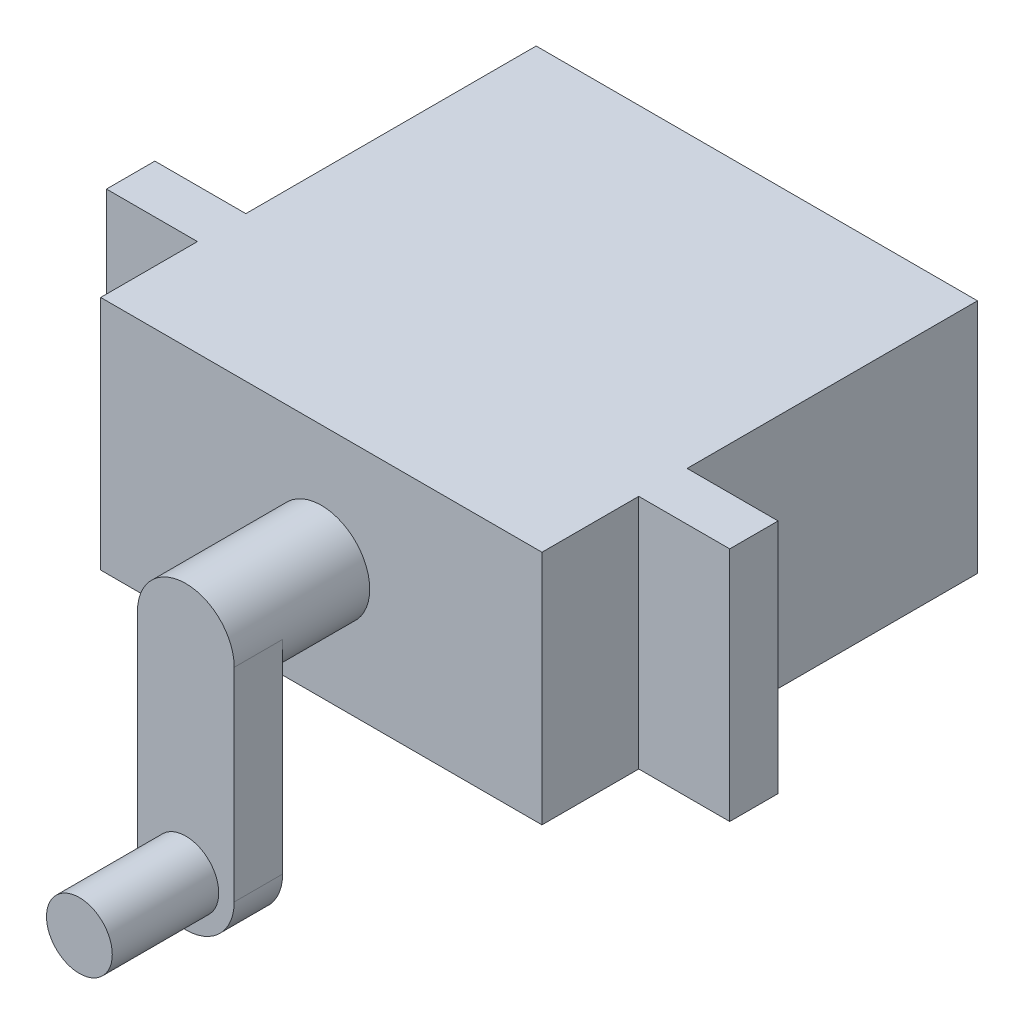
ISO-10303-21;
HEADER;
FILE_DESCRIPTION(('STEP AP214'),'2;1');
FILE_NAME('part.step','',(''),(''),'','','');
FILE_SCHEMA(('AUTOMOTIVE_DESIGN { 1 0 10303 214 1 1 1 1 }'));
ENDSEC;
DATA;
#1=APPLICATION_CONTEXT('core data for automotive mechanical design processes');
#2=APPLICATION_PROTOCOL_DEFINITION('international standard','automotive_design',2000,#1);
#3=PRODUCT_CONTEXT('',#1,'mechanical');
#4=PRODUCT('Part','Part','',(#3));
#5=PRODUCT_RELATED_PRODUCT_CATEGORY('part','',(#4));
#6=PRODUCT_DEFINITION_FORMATION('','',#4);
#7=PRODUCT_DEFINITION_CONTEXT('part definition',#1,'design');
#8=PRODUCT_DEFINITION('design','',#6,#7);
#9=PRODUCT_DEFINITION_SHAPE('','',#8);
#10=(LENGTH_UNIT() NAMED_UNIT(*) SI_UNIT(.MILLI.,.METRE.));
#11=(NAMED_UNIT(*) PLANE_ANGLE_UNIT() SI_UNIT($,.RADIAN.));
#12=(NAMED_UNIT(*) SI_UNIT($,.STERADIAN.) SOLID_ANGLE_UNIT());
#13=UNCERTAINTY_MEASURE_WITH_UNIT(LENGTH_MEASURE(1.E-05),#10,'distance_accuracy_value','');
#14=(GEOMETRIC_REPRESENTATION_CONTEXT(3) GLOBAL_UNCERTAINTY_ASSIGNED_CONTEXT((#13)) GLOBAL_UNIT_ASSIGNED_CONTEXT((#10,
#11,#12)) REPRESENTATION_CONTEXT('',''));
#15=CARTESIAN_POINT('',(0.,0.,0.));
#16=DIRECTION('',(0.,0.,1.));
#17=DIRECTION('',(1.,0.,0.));
#18=AXIS2_PLACEMENT_3D('',#15,#16,#17);
#19=CARTESIAN_POINT('',(-11.4,36.9,-39.5));
#20=DIRECTION('',(-1.,0.,0.));
#21=DIRECTION('',(0.,0.,1.));
#22=AXIS2_PLACEMENT_3D('',#19,#20,#21);
#23=PLANE('',#22);
#24=DIRECTION('',(0.,0.,1.));
#25=VECTOR('',#24,1.);
#26=CARTESIAN_POINT('',(-11.4,49.1,-39.5));
#27=LINE('',#26,#25);
#28=CARTESIAN_POINT('',(-11.4,49.1,-22.));
#29=VERTEX_POINT('',#28);
#30=CARTESIAN_POINT('',(-11.4,49.1,-17.));
#31=VERTEX_POINT('',#30);
#32=EDGE_CURVE('E268',#29,#31,#27,.T.);
#33=ORIENTED_EDGE('',*,*,#32,.F.);
#34=DIRECTION('',(0.,-1.,0.));
#35=VECTOR('',#34,1.);
#36=CARTESIAN_POINT('',(-11.4,36.9,-22.));
#37=LINE('',#36,#35);
#38=CARTESIAN_POINT('',(-11.4,36.9,-22.));
#39=VERTEX_POINT('',#38);
#40=EDGE_CURVE('E234',#29,#39,#37,.T.);
#41=ORIENTED_EDGE('',*,*,#40,.T.);
#42=DIRECTION('',(0.,0.,1.));
#43=VECTOR('',#42,1.);
#44=CARTESIAN_POINT('',(-11.4,36.9,-39.5));
#45=LINE('',#44,#43);
#46=CARTESIAN_POINT('',(-11.4,36.9,-17.));
#47=VERTEX_POINT('',#46);
#48=EDGE_CURVE('E255',#39,#47,#45,.T.);
#49=ORIENTED_EDGE('',*,*,#48,.T.);
#50=DIRECTION('',(0.,-1.,0.));
#51=VECTOR('',#50,1.);
#52=CARTESIAN_POINT('',(-11.4,36.9,-17.));
#53=LINE('',#52,#51);
#54=EDGE_CURVE('E241',#31,#47,#53,.T.);
#55=ORIENTED_EDGE('',*,*,#54,.F.);
#56=EDGE_LOOP('',(#33,#41,#49,#55));
#57=FACE_BOUND('',#56,.T.);
#58=ADVANCED_FACE('F39',(#57),#23,.T.);
#59=CARTESIAN_POINT('',(11.4,36.9,-39.5));
#60=DIRECTION('',(1.,0.,0.));
#61=DIRECTION('',(0.,0.,-1.));
#62=AXIS2_PLACEMENT_3D('',#59,#60,#61);
#63=PLANE('',#62);
#64=DIRECTION('',(0.,0.,1.));
#65=VECTOR('',#64,1.);
#66=CARTESIAN_POINT('',(11.4,36.9,-39.5));
#67=LINE('',#66,#65);
#68=CARTESIAN_POINT('',(11.4,36.9,-22.));
#69=VERTEX_POINT('',#68);
#70=CARTESIAN_POINT('',(11.4,36.9,-17.));
#71=VERTEX_POINT('',#70);
#72=EDGE_CURVE('E274',#69,#71,#67,.T.);
#73=ORIENTED_EDGE('',*,*,#72,.F.);
#74=DIRECTION('',(0.,1.,0.));
#75=VECTOR('',#74,1.);
#76=CARTESIAN_POINT('',(11.4,36.9,-22.));
#77=LINE('',#76,#75);
#78=CARTESIAN_POINT('',(11.4,49.1,-22.));
#79=VERTEX_POINT('',#78);
#80=EDGE_CURVE('E226',#69,#79,#77,.T.);
#81=ORIENTED_EDGE('',*,*,#80,.T.);
#82=DIRECTION('',(0.,0.,1.));
#83=VECTOR('',#82,1.);
#84=CARTESIAN_POINT('',(11.4,49.1,-39.5));
#85=LINE('',#84,#83);
#86=CARTESIAN_POINT('',(11.4,49.1,-17.));
#87=VERTEX_POINT('',#86);
#88=EDGE_CURVE('E271',#79,#87,#85,.T.);
#89=ORIENTED_EDGE('',*,*,#88,.T.);
#90=DIRECTION('',(0.,1.,0.));
#91=VECTOR('',#90,1.);
#92=CARTESIAN_POINT('',(11.4,36.9,-17.));
#93=LINE('',#92,#91);
#94=EDGE_CURVE('E261',#71,#87,#93,.T.);
#95=ORIENTED_EDGE('',*,*,#94,.F.);
#96=EDGE_LOOP('',(#73,#81,#89,#95));
#97=FACE_BOUND('',#96,.T.);
#98=ADVANCED_FACE('F321',(#97),#63,.T.);
#99=DIRECTION('',(0.,-1.,0.));
#100=VECTOR('',#99,1.);
#101=CARTESIAN_POINT('',(-11.4,36.9,-24.5));
#102=LINE('',#101,#100);
#103=CARTESIAN_POINT('',(-11.4,49.1,-24.5));
#104=VERTEX_POINT('',#103);
#105=CARTESIAN_POINT('',(-11.4,36.9,-24.5));
#106=VERTEX_POINT('',#105);
#107=EDGE_CURVE('E239',#104,#106,#102,.T.);
#108=ORIENTED_EDGE('',*,*,#107,.F.);
#109=CARTESIAN_POINT('',(-11.4,49.1,-39.5));
#110=VERTEX_POINT('',#109);
#111=EDGE_CURVE('E48',#110,#104,#27,.T.);
#112=ORIENTED_EDGE('',*,*,#111,.F.);
#113=DIRECTION('',(0.,-1.,0.));
#114=VECTOR('',#113,1.);
#115=CARTESIAN_POINT('',(-11.4,36.9,-39.5));
#116=LINE('',#115,#114);
#117=CARTESIAN_POINT('',(-11.4,36.9,-39.5));
#118=VERTEX_POINT('',#117);
#119=EDGE_CURVE('E242',#110,#118,#116,.T.);
#120=ORIENTED_EDGE('',*,*,#119,.T.);
#121=EDGE_CURVE('E43',#118,#106,#45,.T.);
#122=ORIENTED_EDGE('',*,*,#121,.T.);
#123=EDGE_LOOP('',(#108,#112,#120,#122));
#124=FACE_BOUND('',#123,.T.);
#125=ADVANCED_FACE('F41',(#124),#23,.T.);
#126=CARTESIAN_POINT('',(-11.4,49.1,-39.5));
#127=DIRECTION('',(0.,1.,0.));
#128=DIRECTION('',(0.,0.,1.));
#129=AXIS2_PLACEMENT_3D('',#126,#127,#128);
#130=PLANE('',#129);
#131=ORIENTED_EDGE('',*,*,#111,.T.);
#132=DIRECTION('',(-1.,0.,0.));
#133=VECTOR('',#132,1.);
#134=CARTESIAN_POINT('',(-16.1,49.1,-24.5));
#135=LINE('',#134,#133);
#136=CARTESIAN_POINT('',(-16.1,49.1,-24.5));
#137=VERTEX_POINT('',#136);
#138=EDGE_CURVE('E209',#104,#137,#135,.T.);
#139=ORIENTED_EDGE('',*,*,#138,.T.);
#140=DIRECTION('',(0.,0.,1.));
#141=VECTOR('',#140,1.);
#142=CARTESIAN_POINT('',(-16.1,49.1,-24.5));
#143=LINE('',#142,#141);
#144=CARTESIAN_POINT('',(-16.1,49.1,-22.));
#145=VERTEX_POINT('',#144);
#146=EDGE_CURVE('E223',#137,#145,#143,.T.);
#147=ORIENTED_EDGE('',*,*,#146,.T.);
#148=DIRECTION('',(-1.,0.,0.));
#149=VECTOR('',#148,1.);
#150=CARTESIAN_POINT('',(-16.1,49.1,-22.));
#151=LINE('',#150,#149);
#152=EDGE_CURVE('E221',#29,#145,#151,.T.);
#153=ORIENTED_EDGE('',*,*,#152,.F.);
#154=ORIENTED_EDGE('',*,*,#32,.T.);
#155=DIRECTION('',(-1.,0.,0.));
#156=VECTOR('',#155,1.);
#157=CARTESIAN_POINT('',(-11.4,49.1,-17.));
#158=LINE('',#157,#156);
#159=EDGE_CURVE('E246',#87,#31,#158,.T.);
#160=ORIENTED_EDGE('',*,*,#159,.F.);
#161=ORIENTED_EDGE('',*,*,#88,.F.);
#162=CARTESIAN_POINT('',(16.1,49.1,-22.));
#163=VERTEX_POINT('',#162);
#164=EDGE_CURVE('E64',#163,#79,#151,.T.);
#165=ORIENTED_EDGE('',*,*,#164,.F.);
#166=DIRECTION('',(0.,0.,1.));
#167=VECTOR('',#166,1.);
#168=CARTESIAN_POINT('',(16.1,49.1,-24.5));
#169=LINE('',#168,#167);
#170=CARTESIAN_POINT('',(16.1,49.1,-24.5));
#171=VERTEX_POINT('',#170);
#172=EDGE_CURVE('E227',#171,#163,#169,.T.);
#173=ORIENTED_EDGE('',*,*,#172,.F.);
#174=CARTESIAN_POINT('',(11.4,49.1,-24.5));
#175=VERTEX_POINT('',#174);
#176=EDGE_CURVE('E210',#171,#175,#135,.T.);
#177=ORIENTED_EDGE('',*,*,#176,.T.);
#178=CARTESIAN_POINT('',(11.4,49.1,-39.5));
#179=VERTEX_POINT('',#178);
#180=EDGE_CURVE('E269',#179,#175,#85,.T.);
#181=ORIENTED_EDGE('',*,*,#180,.F.);
#182=DIRECTION('',(-1.,0.,0.));
#183=VECTOR('',#182,1.);
#184=CARTESIAN_POINT('',(-11.4,49.1,-39.5));
#185=LINE('',#184,#183);
#186=EDGE_CURVE('E252',#179,#110,#185,.T.);
#187=ORIENTED_EDGE('',*,*,#186,.T.);
#188=EDGE_LOOP('',(#131,#139,#147,#153,#154,#160,#161,#165,#173,#177,#181,#187));
#189=FACE_BOUND('',#188,.T.);
#190=ADVANCED_FACE('F294',(#189),#130,.T.);
#191=DIRECTION('',(0.,1.,0.));
#192=VECTOR('',#191,1.);
#193=CARTESIAN_POINT('',(11.4,36.9,-24.5));
#194=LINE('',#193,#192);
#195=CARTESIAN_POINT('',(11.4,36.9,-24.5));
#196=VERTEX_POINT('',#195);
#197=EDGE_CURVE('E237',#196,#175,#194,.T.);
#198=ORIENTED_EDGE('',*,*,#197,.F.);
#199=CARTESIAN_POINT('',(11.4,36.9,-39.5));
#200=VERTEX_POINT('',#199);
#201=EDGE_CURVE('E272',#200,#196,#67,.T.);
#202=ORIENTED_EDGE('',*,*,#201,.F.);
#203=DIRECTION('',(0.,1.,0.));
#204=VECTOR('',#203,1.);
#205=CARTESIAN_POINT('',(11.4,36.9,-39.5));
#206=LINE('',#205,#204);
#207=EDGE_CURVE('E249',#200,#179,#206,.T.);
#208=ORIENTED_EDGE('',*,*,#207,.T.);
#209=ORIENTED_EDGE('',*,*,#180,.T.);
#210=EDGE_LOOP('',(#198,#202,#208,#209));
#211=FACE_BOUND('',#210,.T.);
#212=ADVANCED_FACE('F328',(#211),#63,.T.);
#213=CARTESIAN_POINT('',(-11.4,36.9,-39.5));
#214=DIRECTION('',(0.,-1.,0.));
#215=DIRECTION('',(0.,0.,-1.));
#216=AXIS2_PLACEMENT_3D('',#213,#214,#215);
#217=PLANE('',#216);
#218=ORIENTED_EDGE('',*,*,#201,.T.);
#219=DIRECTION('',(1.,0.,0.));
#220=VECTOR('',#219,1.);
#221=CARTESIAN_POINT('',(-16.1,36.9,-24.5));
#222=LINE('',#221,#220);
#223=CARTESIAN_POINT('',(16.1,36.9,-24.5));
#224=VERTEX_POINT('',#223);
#225=EDGE_CURVE('E202',#196,#224,#222,.T.);
#226=ORIENTED_EDGE('',*,*,#225,.T.);
#227=DIRECTION('',(0.,0.,1.));
#228=VECTOR('',#227,1.);
#229=CARTESIAN_POINT('',(16.1,36.9,-24.5));
#230=LINE('',#229,#228);
#231=CARTESIAN_POINT('',(16.1,36.9,-22.));
#232=VERTEX_POINT('',#231);
#233=EDGE_CURVE('E229',#224,#232,#230,.T.);
#234=ORIENTED_EDGE('',*,*,#233,.T.);
#235=DIRECTION('',(1.,0.,0.));
#236=VECTOR('',#235,1.);
#237=CARTESIAN_POINT('',(-16.1,36.9,-22.));
#238=LINE('',#237,#236);
#239=EDGE_CURVE('E216',#69,#232,#238,.T.);
#240=ORIENTED_EDGE('',*,*,#239,.F.);
#241=ORIENTED_EDGE('',*,*,#72,.T.);
#242=DIRECTION('',(1.,0.,0.));
#243=VECTOR('',#242,1.);
#244=CARTESIAN_POINT('',(-11.4,36.9,-17.));
#245=LINE('',#244,#243);
#246=EDGE_CURVE('E258',#47,#71,#245,.T.);
#247=ORIENTED_EDGE('',*,*,#246,.F.);
#248=ORIENTED_EDGE('',*,*,#48,.F.);
#249=CARTESIAN_POINT('',(-16.1,36.9,-22.));
#250=VERTEX_POINT('',#249);
#251=EDGE_CURVE('E217',#250,#39,#238,.T.);
#252=ORIENTED_EDGE('',*,*,#251,.F.);
#253=DIRECTION('',(0.,0.,1.));
#254=VECTOR('',#253,1.);
#255=CARTESIAN_POINT('',(-16.1,36.9,-24.5));
#256=LINE('',#255,#254);
#257=CARTESIAN_POINT('',(-16.1,36.9,-24.5));
#258=VERTEX_POINT('',#257);
#259=EDGE_CURVE('E213',#258,#250,#256,.T.);
#260=ORIENTED_EDGE('',*,*,#259,.F.);
#261=EDGE_CURVE('E203',#258,#106,#222,.T.);
#262=ORIENTED_EDGE('',*,*,#261,.T.);
#263=ORIENTED_EDGE('',*,*,#121,.F.);
#264=DIRECTION('',(1.,0.,0.));
#265=VECTOR('',#264,1.);
#266=CARTESIAN_POINT('',(-11.4,36.9,-39.5));
#267=LINE('',#266,#265);
#268=EDGE_CURVE('E245',#118,#200,#267,.T.);
#269=ORIENTED_EDGE('',*,*,#268,.T.);
#270=EDGE_LOOP('',(#218,#226,#234,#240,#241,#247,#248,#252,#260,#262,#263,#269));
#271=FACE_BOUND('',#270,.T.);
#272=ADVANCED_FACE('F288',(#271),#217,.T.);
#273=CARTESIAN_POINT('',(0.,0.,-39.5));
#274=DIRECTION('',(0.,0.,-1.));
#275=DIRECTION('',(-1.,0.,0.));
#276=AXIS2_PLACEMENT_3D('',#273,#274,#275);
#277=PLANE('',#276);
#278=ORIENTED_EDGE('',*,*,#119,.F.);
#279=ORIENTED_EDGE('',*,*,#186,.F.);
#280=ORIENTED_EDGE('',*,*,#207,.F.);
#281=ORIENTED_EDGE('',*,*,#268,.F.);
#282=EDGE_LOOP('',(#278,#279,#280,#281));
#283=FACE_BOUND('',#282,.T.);
#284=ADVANCED_FACE('F338',(#283),#277,.T.);
#285=CARTESIAN_POINT('',(0.,0.,-17.));
#286=DIRECTION('',(0.,0.,-1.));
#287=DIRECTION('',(-1.,0.,0.));
#288=AXIS2_PLACEMENT_3D('',#285,#286,#287);
#289=PLANE('',#288);
#290=CARTESIAN_POINT('',(0.,43.,-17.));
#291=DIRECTION('',(0.,0.,1.));
#292=DIRECTION('',(1.,0.,0.));
#293=AXIS2_PLACEMENT_3D('',#290,#291,#292);
#294=CIRCLE('',#293,2.5);
#295=CARTESIAN_POINT('',(2.5,43.,-17.));
#296=VERTEX_POINT('',#295);
#297=EDGE_CURVE('E11',#296,#296,#294,.T.);
#298=ORIENTED_EDGE('',*,*,#297,.F.);
#299=EDGE_LOOP('',(#298));
#300=FACE_BOUND('',#299,.T.);
#301=ORIENTED_EDGE('',*,*,#54,.T.);
#302=ORIENTED_EDGE('',*,*,#246,.T.);
#303=ORIENTED_EDGE('',*,*,#94,.T.);
#304=ORIENTED_EDGE('',*,*,#159,.T.);
#305=EDGE_LOOP('',(#301,#302,#303,#304));
#306=FACE_BOUND('',#305,.T.);
#307=ADVANCED_FACE('F290',(#300,#306),#289,.F.);
#308=CARTESIAN_POINT('',(16.1,36.9,-24.5));
#309=DIRECTION('',(1.,0.,0.));
#310=DIRECTION('',(0.,0.,-1.));
#311=AXIS2_PLACEMENT_3D('',#308,#309,#310);
#312=PLANE('',#311);
#313=DIRECTION('',(0.,1.,0.));
#314=VECTOR('',#313,1.);
#315=CARTESIAN_POINT('',(16.1,36.9,-22.));
#316=LINE('',#315,#314);
#317=EDGE_CURVE('E219',#232,#163,#316,.T.);
#318=ORIENTED_EDGE('',*,*,#317,.F.);
#319=ORIENTED_EDGE('',*,*,#233,.F.);
#320=DIRECTION('',(0.,1.,0.));
#321=VECTOR('',#320,1.);
#322=CARTESIAN_POINT('',(16.1,36.9,-24.5));
#323=LINE('',#322,#321);
#324=EDGE_CURVE('E206',#224,#171,#323,.T.);
#325=ORIENTED_EDGE('',*,*,#324,.T.);
#326=ORIENTED_EDGE('',*,*,#172,.T.);
#327=EDGE_LOOP('',(#318,#319,#325,#326));
#328=FACE_BOUND('',#327,.T.);
#329=ADVANCED_FACE('F349',(#328),#312,.T.);
#330=CARTESIAN_POINT('',(0.,0.,-24.5));
#331=DIRECTION('',(0.,0.,-1.));
#332=DIRECTION('',(-1.,0.,0.));
#333=AXIS2_PLACEMENT_3D('',#330,#331,#332);
#334=PLANE('',#333);
#335=ORIENTED_EDGE('',*,*,#225,.F.);
#336=ORIENTED_EDGE('',*,*,#197,.T.);
#337=ORIENTED_EDGE('',*,*,#176,.F.);
#338=ORIENTED_EDGE('',*,*,#324,.F.);
#339=EDGE_LOOP('',(#335,#336,#337,#338));
#340=FACE_BOUND('',#339,.T.);
#341=ADVANCED_FACE('F344',(#340),#334,.T.);
#342=CARTESIAN_POINT('',(0.,0.,-22.));
#343=DIRECTION('',(0.,0.,-1.));
#344=DIRECTION('',(-1.,0.,0.));
#345=AXIS2_PLACEMENT_3D('',#342,#343,#344);
#346=PLANE('',#345);
#347=ORIENTED_EDGE('',*,*,#80,.F.);
#348=ORIENTED_EDGE('',*,*,#239,.T.);
#349=ORIENTED_EDGE('',*,*,#317,.T.);
#350=ORIENTED_EDGE('',*,*,#164,.T.);
#351=EDGE_LOOP('',(#347,#348,#349,#350));
#352=FACE_BOUND('',#351,.T.);
#353=ADVANCED_FACE('F317',(#352),#346,.F.);
#354=ORIENTED_EDGE('',*,*,#138,.F.);
#355=ORIENTED_EDGE('',*,*,#107,.T.);
#356=ORIENTED_EDGE('',*,*,#261,.F.);
#357=DIRECTION('',(0.,-1.,0.));
#358=VECTOR('',#357,1.);
#359=CARTESIAN_POINT('',(-16.1,36.9,-24.5));
#360=LINE('',#359,#358);
#361=EDGE_CURVE('E199',#137,#258,#360,.T.);
#362=ORIENTED_EDGE('',*,*,#361,.F.);
#363=EDGE_LOOP('',(#354,#355,#356,#362));
#364=FACE_BOUND('',#363,.T.);
#365=ADVANCED_FACE('F304',(#364),#334,.T.);
#366=ORIENTED_EDGE('',*,*,#40,.F.);
#367=ORIENTED_EDGE('',*,*,#152,.T.);
#368=DIRECTION('',(0.,-1.,0.));
#369=VECTOR('',#368,1.);
#370=CARTESIAN_POINT('',(-16.1,36.9,-22.));
#371=LINE('',#370,#369);
#372=EDGE_CURVE('E198',#145,#250,#371,.T.);
#373=ORIENTED_EDGE('',*,*,#372,.T.);
#374=ORIENTED_EDGE('',*,*,#251,.T.);
#375=EDGE_LOOP('',(#366,#367,#373,#374));
#376=FACE_BOUND('',#375,.T.);
#377=ADVANCED_FACE('F299',(#376),#346,.F.);
#378=CARTESIAN_POINT('',(-16.1,36.9,-24.5));
#379=DIRECTION('',(-1.,0.,0.));
#380=DIRECTION('',(0.,0.,1.));
#381=AXIS2_PLACEMENT_3D('',#378,#379,#380);
#382=PLANE('',#381);
#383=ORIENTED_EDGE('',*,*,#372,.F.);
#384=ORIENTED_EDGE('',*,*,#146,.F.);
#385=ORIENTED_EDGE('',*,*,#361,.T.);
#386=ORIENTED_EDGE('',*,*,#259,.T.);
#387=EDGE_LOOP('',(#383,#384,#385,#386));
#388=FACE_BOUND('',#387,.T.);
#389=ADVANCED_FACE('F305',(#388),#382,.T.);
#390=CARTESIAN_POINT('',(0.,43.,-17.));
#391=DIRECTION('',(0.,0.,1.));
#392=DIRECTION('',(1.,0.,0.));
#393=AXIS2_PLACEMENT_3D('',#390,#391,#392);
#394=CYLINDRICAL_SURFACE('',#393,2.5);
#395=ORIENTED_EDGE('',*,*,#297,.T.);
#396=EDGE_LOOP('',(#395));
#397=FACE_BOUND('',#396,.T.);
#398=CARTESIAN_POINT('',(0.,43.,-12.5));
#399=DIRECTION('',(0.,0.,1.));
#400=DIRECTION('',(1.,0.,0.));
#401=AXIS2_PLACEMENT_3D('',#398,#399,#400);
#402=CIRCLE('',#401,2.5);
#403=CARTESIAN_POINT('',(-2.5,43.,-12.5));
#404=VERTEX_POINT('',#403);
#405=CARTESIAN_POINT('',(2.5,43.,-12.5));
#406=VERTEX_POINT('',#405);
#407=EDGE_CURVE('E56',#404,#406,#402,.T.);
#408=ORIENTED_EDGE('',*,*,#407,.F.);
#409=DIRECTION('',(0.,0.,1.));
#410=VECTOR('',#409,1.);
#411=CARTESIAN_POINT('',(-2.5,43.,-12.5));
#412=LINE('',#411,#410);
#413=CARTESIAN_POINT('',(-2.5,43.,-10.));
#414=VERTEX_POINT('',#413);
#415=EDGE_CURVE('E194',#404,#414,#412,.T.);
#416=ORIENTED_EDGE('',*,*,#415,.T.);
#417=CARTESIAN_POINT('',(0.,43.,-10.));
#418=DIRECTION('',(0.,0.,1.));
#419=DIRECTION('',(-1.,0.,0.));
#420=AXIS2_PLACEMENT_3D('',#417,#418,#419);
#421=CIRCLE('',#420,2.5);
#422=CARTESIAN_POINT('',(2.5,43.,-10.));
#423=VERTEX_POINT('',#422);
#424=EDGE_CURVE('E180',#423,#414,#421,.T.);
#425=ORIENTED_EDGE('',*,*,#424,.F.);
#426=DIRECTION('',(0.,0.,1.));
#427=VECTOR('',#426,1.);
#428=CARTESIAN_POINT('',(2.5,43.,-12.5));
#429=LINE('',#428,#427);
#430=EDGE_CURVE('E165',#406,#423,#429,.T.);
#431=ORIENTED_EDGE('',*,*,#430,.F.);
#432=EDGE_LOOP('',(#408,#416,#425,#431));
#433=FACE_BOUND('',#432,.T.);
#434=ADVANCED_FACE('F307',(#397,#433),#394,.T.);
#435=CARTESIAN_POINT('',(0.,32.5,-12.5));
#436=DIRECTION('',(0.,0.,1.));
#437=DIRECTION('',(1.,0.,0.));
#438=AXIS2_PLACEMENT_3D('',#435,#436,#437);
#439=CYLINDRICAL_SURFACE('',#438,2.5);
#440=CARTESIAN_POINT('',(0.,32.5,-10.));
#441=DIRECTION('',(0.,0.,1.));
#442=DIRECTION('',(-1.,0.,0.));
#443=AXIS2_PLACEMENT_3D('',#440,#441,#442);
#444=CIRCLE('',#443,2.5);
#445=CARTESIAN_POINT('',(-2.5,32.5,-10.));
#446=VERTEX_POINT('',#445);
#447=CARTESIAN_POINT('',(2.5,32.5,-10.));
#448=VERTEX_POINT('',#447);
#449=EDGE_CURVE('E187',#446,#448,#444,.T.);
#450=ORIENTED_EDGE('',*,*,#449,.F.);
#451=DIRECTION('',(0.,0.,1.));
#452=VECTOR('',#451,1.);
#453=CARTESIAN_POINT('',(-2.5,32.5,-12.5));
#454=LINE('',#453,#452);
#455=CARTESIAN_POINT('',(-2.5,32.5,-12.5));
#456=VERTEX_POINT('',#455);
#457=EDGE_CURVE('E176',#456,#446,#454,.T.);
#458=ORIENTED_EDGE('',*,*,#457,.F.);
#459=CARTESIAN_POINT('',(0.,32.5,-12.5));
#460=DIRECTION('',(0.,0.,1.));
#461=DIRECTION('',(-1.,0.,0.));
#462=AXIS2_PLACEMENT_3D('',#459,#460,#461);
#463=CIRCLE('',#462,2.5);
#464=CARTESIAN_POINT('',(2.5,32.5,-12.5));
#465=VERTEX_POINT('',#464);
#466=EDGE_CURVE('E172',#456,#465,#463,.T.);
#467=ORIENTED_EDGE('',*,*,#466,.T.);
#468=DIRECTION('',(0.,0.,1.));
#469=VECTOR('',#468,1.);
#470=CARTESIAN_POINT('',(2.5,32.5,-12.5));
#471=LINE('',#470,#469);
#472=EDGE_CURVE('E155',#465,#448,#471,.T.);
#473=ORIENTED_EDGE('',*,*,#472,.T.);
#474=EDGE_LOOP('',(#450,#458,#467,#473));
#475=FACE_BOUND('',#474,.T.);
#476=ADVANCED_FACE('F175',(#475),#439,.T.);
#477=CARTESIAN_POINT('',(-2.5,32.5,-12.5));
#478=DIRECTION('',(-1.,0.,0.));
#479=DIRECTION('',(0.,0.,1.));
#480=AXIS2_PLACEMENT_3D('',#477,#478,#479);
#481=PLANE('',#480);
#482=DIRECTION('',(0.,-1.,0.));
#483=VECTOR('',#482,1.);
#484=CARTESIAN_POINT('',(-2.5,32.5,-10.));
#485=LINE('',#484,#483);
#486=EDGE_CURVE('E177',#414,#446,#485,.T.);
#487=ORIENTED_EDGE('',*,*,#486,.F.);
#488=ORIENTED_EDGE('',*,*,#415,.F.);
#489=DIRECTION('',(0.,-1.,0.));
#490=VECTOR('',#489,1.);
#491=CARTESIAN_POINT('',(-2.5,32.5,-12.5));
#492=LINE('',#491,#490);
#493=EDGE_CURVE('E166',#404,#456,#492,.T.);
#494=ORIENTED_EDGE('',*,*,#493,.T.);
#495=ORIENTED_EDGE('',*,*,#457,.T.);
#496=EDGE_LOOP('',(#487,#488,#494,#495));
#497=FACE_BOUND('',#496,.T.);
#498=ADVANCED_FACE('F452',(#497),#481,.T.);
#499=CARTESIAN_POINT('',(2.5,43.,-12.5));
#500=DIRECTION('',(1.,0.,0.));
#501=DIRECTION('',(0.,0.,-1.));
#502=AXIS2_PLACEMENT_3D('',#499,#500,#501);
#503=PLANE('',#502);
#504=DIRECTION('',(0.,1.,0.));
#505=VECTOR('',#504,1.);
#506=CARTESIAN_POINT('',(2.5,43.,-10.));
#507=LINE('',#506,#505);
#508=EDGE_CURVE('E160',#448,#423,#507,.T.);
#509=ORIENTED_EDGE('',*,*,#508,.F.);
#510=ORIENTED_EDGE('',*,*,#472,.F.);
#511=DIRECTION('',(0.,1.,0.));
#512=VECTOR('',#511,1.);
#513=CARTESIAN_POINT('',(2.5,43.,-12.5));
#514=LINE('',#513,#512);
#515=EDGE_CURVE('E158',#465,#406,#514,.T.);
#516=ORIENTED_EDGE('',*,*,#515,.T.);
#517=ORIENTED_EDGE('',*,*,#430,.T.);
#518=EDGE_LOOP('',(#509,#510,#516,#517));
#519=FACE_BOUND('',#518,.T.);
#520=ADVANCED_FACE('F157',(#519),#503,.T.);
#521=CARTESIAN_POINT('',(0.,32.5,-12.5));
#522=DIRECTION('',(0.,0.,-1.));
#523=DIRECTION('',(-1.,0.,0.));
#524=AXIS2_PLACEMENT_3D('',#521,#522,#523);
#525=PLANE('',#524);
#526=ORIENTED_EDGE('',*,*,#493,.F.);
#527=ORIENTED_EDGE('',*,*,#407,.T.);
#528=ORIENTED_EDGE('',*,*,#515,.F.);
#529=ORIENTED_EDGE('',*,*,#466,.F.);
#530=EDGE_LOOP('',(#526,#527,#528,#529));
#531=FACE_BOUND('',#530,.T.);
#532=ADVANCED_FACE('F171',(#531),#525,.T.);
#533=CARTESIAN_POINT('',(0.,32.5,-10.));
#534=DIRECTION('',(0.,0.,-1.));
#535=DIRECTION('',(-1.,0.,0.));
#536=AXIS2_PLACEMENT_3D('',#533,#534,#535);
#537=PLANE('',#536);
#538=CARTESIAN_POINT('',(0.,32.5,-10.));
#539=DIRECTION('',(0.,0.,1.));
#540=DIRECTION('',(1.,0.,0.));
#541=AXIS2_PLACEMENT_3D('',#538,#539,#540);
#542=CIRCLE('',#541,1.7);
#543=CARTESIAN_POINT('',(1.7,32.5,-10.));
#544=VERTEX_POINT('',#543);
#545=EDGE_CURVE('E189',#544,#544,#542,.T.);
#546=ORIENTED_EDGE('',*,*,#545,.F.);
#547=EDGE_LOOP('',(#546));
#548=FACE_BOUND('',#547,.T.);
#549=ORIENTED_EDGE('',*,*,#449,.T.);
#550=ORIENTED_EDGE('',*,*,#508,.T.);
#551=ORIENTED_EDGE('',*,*,#424,.T.);
#552=ORIENTED_EDGE('',*,*,#486,.T.);
#553=EDGE_LOOP('',(#549,#550,#551,#552));
#554=FACE_BOUND('',#553,.T.);
#555=ADVANCED_FACE('F475',(#548,#554),#537,.F.);
#556=CARTESIAN_POINT('',(0.,32.5,-10.));
#557=DIRECTION('',(0.,0.,1.));
#558=DIRECTION('',(1.,0.,0.));
#559=AXIS2_PLACEMENT_3D('',#556,#557,#558);
#560=CYLINDRICAL_SURFACE('',#559,1.7);
#561=ORIENTED_EDGE('',*,*,#545,.T.);
#562=EDGE_LOOP('',(#561));
#563=FACE_BOUND('',#562,.T.);
#564=CARTESIAN_POINT('',(0.,32.5,-4.5));
#565=DIRECTION('',(0.,0.,1.));
#566=DIRECTION('',(1.,0.,0.));
#567=AXIS2_PLACEMENT_3D('',#564,#565,#566);
#568=CIRCLE('',#567,1.7);
#569=CARTESIAN_POINT('',(1.7,32.5,-4.5));
#570=VERTEX_POINT('',#569);
#571=EDGE_CURVE('E183',#570,#570,#568,.T.);
#572=ORIENTED_EDGE('',*,*,#571,.F.);
#573=EDGE_LOOP('',(#572));
#574=FACE_BOUND('',#573,.T.);
#575=ADVANCED_FACE('F483',(#563,#574),#560,.T.);
#576=CARTESIAN_POINT('',(0.,32.5,-4.5));
#577=DIRECTION('',(0.,0.,1.));
#578=DIRECTION('',(1.,0.,0.));
#579=AXIS2_PLACEMENT_3D('',#576,#577,#578);
#580=PLANE('',#579);
#581=ORIENTED_EDGE('',*,*,#571,.T.);
#582=EDGE_LOOP('',(#581));
#583=FACE_BOUND('',#582,.T.);
#584=ADVANCED_FACE('F492',(#583),#580,.T.);
#585=CLOSED_SHELL('',(#58,#98,#125,#190,#212,#272,#284,#307,#329,#341,#353,#365,#377,#389,#434,
#476,#498,#520,#532,#555,#575,#584));
#586=MANIFOLD_SOLID_BREP('B2',#585);
#587=ADVANCED_BREP_SHAPE_REPRESENTATION('',(#18,#586),#14);
#588=SHAPE_DEFINITION_REPRESENTATION(#9,#587);
ENDSEC;
END-ISO-10303-21;
